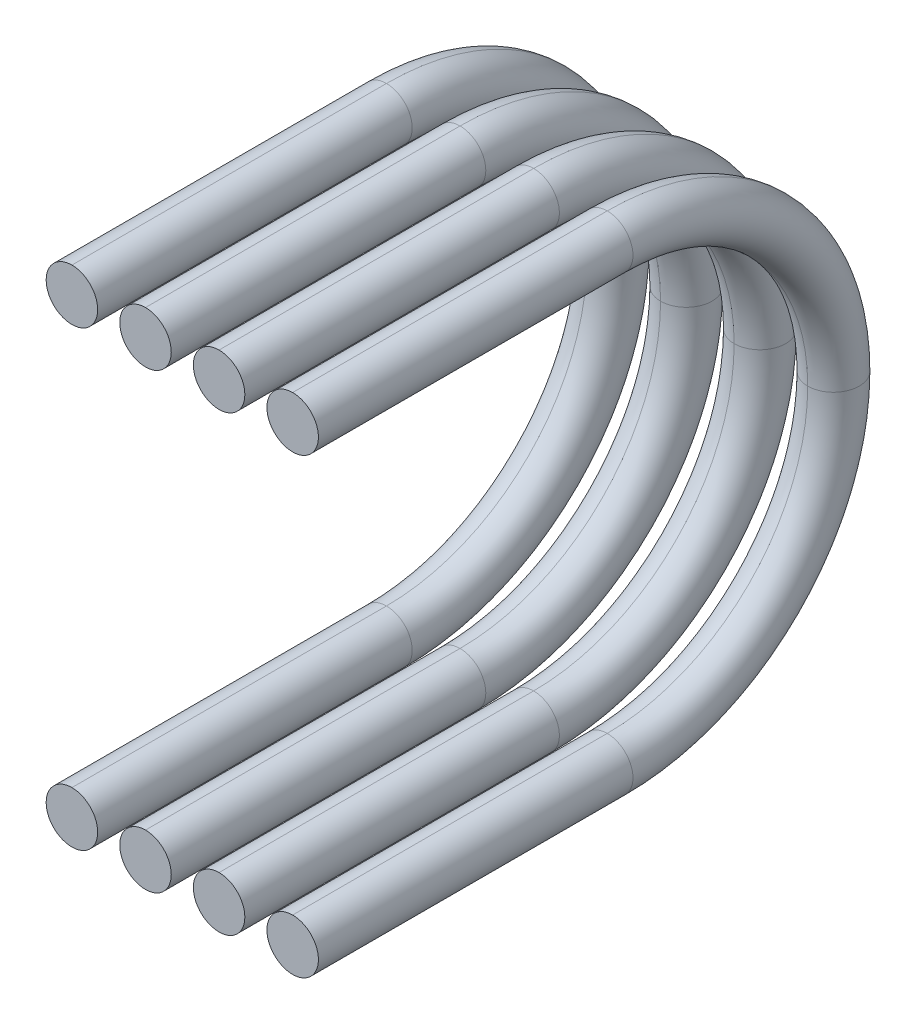
ISO-10303-21;
HEADER;
FILE_DESCRIPTION(('STEP AP214'),'2;1');
FILE_NAME('part.step','',(''),(''),'','','');
FILE_SCHEMA(('AUTOMOTIVE_DESIGN { 1 0 10303 214 1 1 1 1 }'));
ENDSEC;
DATA;
#1=APPLICATION_CONTEXT('core data for automotive mechanical design processes');
#2=APPLICATION_PROTOCOL_DEFINITION('international standard','automotive_design',2000,#1);
#3=PRODUCT_CONTEXT('',#1,'mechanical');
#4=PRODUCT('Part','Part','',(#3));
#5=PRODUCT_RELATED_PRODUCT_CATEGORY('part','',(#4));
#6=PRODUCT_DEFINITION_FORMATION('','',#4);
#7=PRODUCT_DEFINITION_CONTEXT('part definition',#1,'design');
#8=PRODUCT_DEFINITION('design','',#6,#7);
#9=PRODUCT_DEFINITION_SHAPE('','',#8);
#10=(LENGTH_UNIT() NAMED_UNIT(*) SI_UNIT(.MILLI.,.METRE.));
#11=(NAMED_UNIT(*) PLANE_ANGLE_UNIT() SI_UNIT($,.RADIAN.));
#12=(NAMED_UNIT(*) SI_UNIT($,.STERADIAN.) SOLID_ANGLE_UNIT());
#13=UNCERTAINTY_MEASURE_WITH_UNIT(LENGTH_MEASURE(1.E-05),#10,'distance_accuracy_value','');
#14=(GEOMETRIC_REPRESENTATION_CONTEXT(3) GLOBAL_UNCERTAINTY_ASSIGNED_CONTEXT((#13)) GLOBAL_UNIT_ASSIGNED_CONTEXT((#10,
#11,#12)) REPRESENTATION_CONTEXT('',''));
#15=CARTESIAN_POINT('',(0.,0.,0.));
#16=DIRECTION('',(0.,0.,1.));
#17=DIRECTION('',(1.,0.,0.));
#18=AXIS2_PLACEMENT_3D('',#15,#16,#17);
#19=CARTESIAN_POINT('',(0.,0.,0.));
#20=DIRECTION('',(0.,0.,1.));
#21=DIRECTION('',(1.,0.,0.));
#22=AXIS2_PLACEMENT_3D('',#19,#20,#21);
#23=PLANE('',#22);
#24=CARTESIAN_POINT('',(0.,0.,0.));
#25=DIRECTION('',(0.,0.,1.));
#26=DIRECTION('',(1.,0.,0.));
#27=AXIS2_PLACEMENT_3D('',#24,#25,#26);
#28=CIRCLE('',#27,0.7);
#29=CARTESIAN_POINT('',(0.,0.7,0.));
#30=VERTEX_POINT('',#29);
#31=CARTESIAN_POINT('',(0.,-0.7,0.));
#32=VERTEX_POINT('',#31);
#33=EDGE_CURVE('P0_E11',#30,#32,#28,.T.);
#34=ORIENTED_EDGE('',*,*,#33,.T.);
#35=CARTESIAN_POINT('',(0.,0.,0.));
#36=DIRECTION('',(0.,0.,1.));
#37=DIRECTION('',(1.,0.,0.));
#38=AXIS2_PLACEMENT_3D('',#35,#36,#37);
#39=CIRCLE('',#38,0.7);
#40=EDGE_CURVE('P0_E92',#32,#30,#39,.T.);
#41=ORIENTED_EDGE('',*,*,#40,.T.);
#42=EDGE_LOOP('',(#34,#41));
#43=FACE_BOUND('',#42,.T.);
#44=ADVANCED_FACE('P0_F17',(#43),#23,.T.);
#45=CARTESIAN_POINT('',(0.,12.3,0.));
#46=DIRECTION('',(0.,0.,-1.));
#47=DIRECTION('',(-1.,0.,0.));
#48=AXIS2_PLACEMENT_3D('',#45,#46,#47);
#49=PLANE('',#48);
#50=CARTESIAN_POINT('',(0.,12.3,0.));
#51=DIRECTION('',(0.,0.,-1.));
#52=DIRECTION('',(1.,0.,0.));
#53=AXIS2_PLACEMENT_3D('',#50,#51,#52);
#54=CIRCLE('',#53,0.7);
#55=CARTESIAN_POINT('',(0.,11.6,0.));
#56=VERTEX_POINT('',#55);
#57=CARTESIAN_POINT('',(0.,13.,0.));
#58=VERTEX_POINT('',#57);
#59=EDGE_CURVE('P0_E28',#56,#58,#54,.T.);
#60=ORIENTED_EDGE('',*,*,#59,.F.);
#61=CARTESIAN_POINT('',(0.,12.3,0.));
#62=DIRECTION('',(0.,0.,-1.));
#63=DIRECTION('',(1.,0.,0.));
#64=AXIS2_PLACEMENT_3D('',#61,#62,#63);
#65=CIRCLE('',#64,0.7);
#66=EDGE_CURVE('P0_E136',#58,#56,#65,.T.);
#67=ORIENTED_EDGE('',*,*,#66,.F.);
#68=EDGE_LOOP('',(#60,#67));
#69=FACE_BOUND('',#68,.T.);
#70=ADVANCED_FACE('P0_F242',(#69),#49,.F.);
#71=CARTESIAN_POINT('',(0.,0.,0.));
#72=DIRECTION('',(0.,0.,-1.));
#73=DIRECTION('',(0.,1.,0.));
#74=AXIS2_PLACEMENT_3D('',#71,#72,#73);
#75=CYLINDRICAL_SURFACE('',#74,0.7);
#76=DIRECTION('',(0.,0.,-1.));
#77=VECTOR('',#76,1.);
#78=CARTESIAN_POINT('',(0.,-0.7,0.));
#79=LINE('',#78,#77);
#80=CARTESIAN_POINT('',(0.,-0.7,-8.55));
#81=VERTEX_POINT('',#80);
#82=EDGE_CURVE('P0_E129',#32,#81,#79,.T.);
#83=ORIENTED_EDGE('',*,*,#82,.F.);
#84=ORIENTED_EDGE('',*,*,#33,.F.);
#85=DIRECTION('',(0.,0.,-1.));
#86=VECTOR('',#85,1.);
#87=CARTESIAN_POINT('',(0.,0.7,0.));
#88=LINE('',#87,#86);
#89=CARTESIAN_POINT('',(0.,0.7,-8.55));
#90=VERTEX_POINT('',#89);
#91=EDGE_CURVE('P0_E125',#30,#90,#88,.T.);
#92=ORIENTED_EDGE('',*,*,#91,.T.);
#93=CARTESIAN_POINT('',(0.,0.,-8.55));
#94=DIRECTION('',(0.,0.,1.));
#95=DIRECTION('',(1.,0.,0.));
#96=AXIS2_PLACEMENT_3D('',#93,#94,#95);
#97=CIRCLE('',#96,0.7);
#98=EDGE_CURVE('P0_E93',#90,#81,#97,.T.);
#99=ORIENTED_EDGE('',*,*,#98,.T.);
#100=EDGE_LOOP('',(#83,#84,#92,#99));
#101=FACE_BOUND('',#100,.T.);
#102=ADVANCED_FACE('P0_F269',(#101),#75,.T.);
#103=CARTESIAN_POINT('',(0.,6.15,-8.55));
#104=DIRECTION('',(1.,0.,0.));
#105=DIRECTION('',(0.,0.,-1.));
#106=AXIS2_PLACEMENT_3D('',#103,#104,#105);
#107=TOROIDAL_SURFACE('',#106,6.15,0.7);
#108=CARTESIAN_POINT('',(0.,6.15,-8.55));
#109=DIRECTION('',(1.,0.,0.));
#110=DIRECTION('',(0.,0.,-1.));
#111=AXIS2_PLACEMENT_3D('',#108,#109,#110);
#112=CIRCLE('',#111,6.85);
#113=CARTESIAN_POINT('',(0.,6.15,-15.4));
#114=VERTEX_POINT('',#113);
#115=CARTESIAN_POINT('',(0.,13.,-8.55));
#116=VERTEX_POINT('',#115);
#117=EDGE_CURVE('P0_E86',#114,#116,#112,.T.);
#118=ORIENTED_EDGE('',*,*,#117,.F.);
#119=CARTESIAN_POINT('',(0.,6.15,-14.7));
#120=DIRECTION('',(0.,-1.,0.));
#121=DIRECTION('',(0.,0.,-1.));
#122=AXIS2_PLACEMENT_3D('',#119,#120,#121);
#123=CIRCLE('',#122,0.7);
#124=CARTESIAN_POINT('',(0.,6.15,-14.));
#125=VERTEX_POINT('',#124);
#126=EDGE_CURVE('P0_E79',#125,#114,#123,.T.);
#127=ORIENTED_EDGE('',*,*,#126,.F.);
#128=CARTESIAN_POINT('',(0.,6.15,-8.55));
#129=DIRECTION('',(1.,0.,0.));
#130=DIRECTION('',(0.,0.,-1.));
#131=AXIS2_PLACEMENT_3D('',#128,#129,#130);
#132=CIRCLE('',#131,5.45);
#133=CARTESIAN_POINT('',(0.,11.6,-8.55));
#134=VERTEX_POINT('',#133);
#135=EDGE_CURVE('P0_E83',#125,#134,#132,.T.);
#136=ORIENTED_EDGE('',*,*,#135,.T.);
#137=CARTESIAN_POINT('',(0.,12.3,-8.55));
#138=DIRECTION('',(0.,0.,-1.));
#139=DIRECTION('',(1.,0.,0.));
#140=AXIS2_PLACEMENT_3D('',#137,#138,#139);
#141=CIRCLE('',#140,0.7);
#142=EDGE_CURVE('P0_E73',#134,#116,#141,.T.);
#143=ORIENTED_EDGE('',*,*,#142,.T.);
#144=EDGE_LOOP('',(#118,#127,#136,#143));
#145=FACE_BOUND('',#144,.T.);
#146=ADVANCED_FACE('P0_F81',(#145),#107,.T.);
#147=CARTESIAN_POINT('',(0.,12.3,-8.55));
#148=DIRECTION('',(0.,0.,1.));
#149=DIRECTION('',(0.,-1.,0.));
#150=AXIS2_PLACEMENT_3D('',#147,#148,#149);
#151=CYLINDRICAL_SURFACE('',#150,0.7);
#152=DIRECTION('',(0.,0.,1.));
#153=VECTOR('',#152,1.);
#154=CARTESIAN_POINT('',(0.,13.,-8.55));
#155=LINE('',#154,#153);
#156=EDGE_CURVE('P0_E104',#116,#58,#155,.T.);
#157=ORIENTED_EDGE('',*,*,#156,.F.);
#158=ORIENTED_EDGE('',*,*,#142,.F.);
#159=DIRECTION('',(0.,0.,1.));
#160=VECTOR('',#159,1.);
#161=CARTESIAN_POINT('',(0.,11.6,-8.55));
#162=LINE('',#161,#160);
#163=EDGE_CURVE('P0_E21',#134,#56,#162,.T.);
#164=ORIENTED_EDGE('',*,*,#163,.T.);
#165=ORIENTED_EDGE('',*,*,#59,.T.);
#166=EDGE_LOOP('',(#157,#158,#164,#165));
#167=FACE_BOUND('',#166,.T.);
#168=ADVANCED_FACE('P0_F251',(#167),#151,.T.);
#169=CARTESIAN_POINT('',(0.,0.,0.));
#170=DIRECTION('',(0.,0.,-1.));
#171=DIRECTION('',(0.,1.,0.));
#172=AXIS2_PLACEMENT_3D('',#169,#170,#171);
#173=CYLINDRICAL_SURFACE('',#172,0.7);
#174=ORIENTED_EDGE('',*,*,#40,.F.);
#175=ORIENTED_EDGE('',*,*,#82,.T.);
#176=CARTESIAN_POINT('',(0.,0.,-8.55));
#177=DIRECTION('',(0.,0.,1.));
#178=DIRECTION('',(1.,0.,0.));
#179=AXIS2_PLACEMENT_3D('',#176,#177,#178);
#180=CIRCLE('',#179,0.7);
#181=EDGE_CURVE('P0_E113',#81,#90,#180,.T.);
#182=ORIENTED_EDGE('',*,*,#181,.T.);
#183=ORIENTED_EDGE('',*,*,#91,.F.);
#184=EDGE_LOOP('',(#174,#175,#182,#183));
#185=FACE_BOUND('',#184,.T.);
#186=ADVANCED_FACE('P0_F256',(#185),#173,.T.);
#187=CARTESIAN_POINT('',(0.,6.15,-8.55));
#188=DIRECTION('',(1.,0.,0.));
#189=DIRECTION('',(0.,0.,-1.));
#190=AXIS2_PLACEMENT_3D('',#187,#188,#189);
#191=TOROIDAL_SURFACE('',#190,6.15,0.7);
#192=CARTESIAN_POINT('',(0.,6.15,-8.55));
#193=DIRECTION('',(1.,0.,0.));
#194=DIRECTION('',(0.,0.,-1.));
#195=AXIS2_PLACEMENT_3D('',#192,#193,#194);
#196=CIRCLE('',#195,6.85);
#197=EDGE_CURVE('P0_E105',#81,#114,#196,.T.);
#198=ORIENTED_EDGE('',*,*,#197,.F.);
#199=ORIENTED_EDGE('',*,*,#98,.F.);
#200=CARTESIAN_POINT('',(0.,6.15,-8.55));
#201=DIRECTION('',(1.,0.,0.));
#202=DIRECTION('',(0.,0.,-1.));
#203=AXIS2_PLACEMENT_3D('',#200,#201,#202);
#204=CIRCLE('',#203,5.45);
#205=EDGE_CURVE('P0_E97',#90,#125,#204,.T.);
#206=ORIENTED_EDGE('',*,*,#205,.T.);
#207=ORIENTED_EDGE('',*,*,#126,.T.);
#208=EDGE_LOOP('',(#198,#199,#206,#207));
#209=FACE_BOUND('',#208,.T.);
#210=ADVANCED_FACE('P0_F19',(#209),#191,.T.);
#211=CARTESIAN_POINT('',(0.,12.3,-8.55));
#212=DIRECTION('',(0.,0.,1.));
#213=DIRECTION('',(0.,-1.,0.));
#214=AXIS2_PLACEMENT_3D('',#211,#212,#213);
#215=CYLINDRICAL_SURFACE('',#214,0.7);
#216=CARTESIAN_POINT('',(0.,12.3,-8.55));
#217=DIRECTION('',(0.,0.,-1.));
#218=DIRECTION('',(1.,0.,0.));
#219=AXIS2_PLACEMENT_3D('',#216,#217,#218);
#220=CIRCLE('',#219,0.7);
#221=EDGE_CURVE('P0_E111',#116,#134,#220,.T.);
#222=ORIENTED_EDGE('',*,*,#221,.F.);
#223=ORIENTED_EDGE('',*,*,#156,.T.);
#224=ORIENTED_EDGE('',*,*,#66,.T.);
#225=ORIENTED_EDGE('',*,*,#163,.F.);
#226=EDGE_LOOP('',(#222,#223,#224,#225));
#227=FACE_BOUND('',#226,.T.);
#228=ADVANCED_FACE('P0_F225',(#227),#215,.T.);
#229=CARTESIAN_POINT('',(0.,6.15,-8.55));
#230=DIRECTION('',(1.,0.,0.));
#231=DIRECTION('',(0.,0.,-1.));
#232=AXIS2_PLACEMENT_3D('',#229,#230,#231);
#233=TOROIDAL_SURFACE('',#232,6.15,0.7);
#234=ORIENTED_EDGE('',*,*,#181,.F.);
#235=ORIENTED_EDGE('',*,*,#197,.T.);
#236=CARTESIAN_POINT('',(0.,6.15,-14.7));
#237=DIRECTION('',(0.,-1.,0.));
#238=DIRECTION('',(0.,0.,-1.));
#239=AXIS2_PLACEMENT_3D('',#236,#237,#238);
#240=CIRCLE('',#239,0.7);
#241=EDGE_CURVE('P0_E109',#114,#125,#240,.T.);
#242=ORIENTED_EDGE('',*,*,#241,.T.);
#243=ORIENTED_EDGE('',*,*,#205,.F.);
#244=EDGE_LOOP('',(#234,#235,#242,#243));
#245=FACE_BOUND('',#244,.T.);
#246=ADVANCED_FACE('P0_F115',(#245),#233,.T.);
#247=CARTESIAN_POINT('',(0.,6.15,-8.55));
#248=DIRECTION('',(1.,0.,0.));
#249=DIRECTION('',(0.,0.,-1.));
#250=AXIS2_PLACEMENT_3D('',#247,#248,#249);
#251=TOROIDAL_SURFACE('',#250,6.15,0.7);
#252=ORIENTED_EDGE('',*,*,#241,.F.);
#253=ORIENTED_EDGE('',*,*,#117,.T.);
#254=ORIENTED_EDGE('',*,*,#221,.T.);
#255=ORIENTED_EDGE('',*,*,#135,.F.);
#256=EDGE_LOOP('',(#252,#253,#254,#255));
#257=FACE_BOUND('',#256,.T.);
#258=ADVANCED_FACE('P0_F108',(#257),#251,.T.);
#259=CLOSED_SHELL('',(#44,#70,#102,#146,#168,#186,#210,#228,#246,#258));
#260=MANIFOLD_SOLID_BREP('P0_B1',#259);
#261=CARTESIAN_POINT('',(2.,0.,0.));
#262=DIRECTION('',(0.,0.,1.));
#263=DIRECTION('',(1.,0.,0.));
#264=AXIS2_PLACEMENT_3D('',#261,#262,#263);
#265=PLANE('',#264);
#266=CARTESIAN_POINT('',(2.,0.,0.));
#267=DIRECTION('',(0.,0.,1.));
#268=DIRECTION('',(1.,0.,0.));
#269=AXIS2_PLACEMENT_3D('',#266,#267,#268);
#270=CIRCLE('',#269,0.7);
#271=CARTESIAN_POINT('',(2.,0.7,0.));
#272=VERTEX_POINT('',#271);
#273=CARTESIAN_POINT('',(2.,-0.7,0.));
#274=VERTEX_POINT('',#273);
#275=EDGE_CURVE('P1_E11',#272,#274,#270,.T.);
#276=ORIENTED_EDGE('',*,*,#275,.T.);
#277=CARTESIAN_POINT('',(2.,0.,0.));
#278=DIRECTION('',(0.,0.,1.));
#279=DIRECTION('',(1.,0.,0.));
#280=AXIS2_PLACEMENT_3D('',#277,#278,#279);
#281=CIRCLE('',#280,0.7);
#282=EDGE_CURVE('P1_E135',#274,#272,#281,.T.);
#283=ORIENTED_EDGE('',*,*,#282,.T.);
#284=EDGE_LOOP('',(#276,#283));
#285=FACE_BOUND('',#284,.T.);
#286=ADVANCED_FACE('P1_F17',(#285),#265,.T.);
#287=CARTESIAN_POINT('',(2.,12.3,0.));
#288=DIRECTION('',(0.,0.,-1.));
#289=DIRECTION('',(-1.,0.,0.));
#290=AXIS2_PLACEMENT_3D('',#287,#288,#289);
#291=PLANE('',#290);
#292=CARTESIAN_POINT('',(2.,12.3,0.));
#293=DIRECTION('',(0.,0.,-1.));
#294=DIRECTION('',(1.,0.,0.));
#295=AXIS2_PLACEMENT_3D('',#292,#293,#294);
#296=CIRCLE('',#295,0.7);
#297=CARTESIAN_POINT('',(2.,11.6,0.));
#298=VERTEX_POINT('',#297);
#299=CARTESIAN_POINT('',(2.,13.,0.));
#300=VERTEX_POINT('',#299);
#301=EDGE_CURVE('P1_E28',#298,#300,#296,.T.);
#302=ORIENTED_EDGE('',*,*,#301,.F.);
#303=CARTESIAN_POINT('',(2.,12.3,0.));
#304=DIRECTION('',(0.,0.,-1.));
#305=DIRECTION('',(1.,0.,0.));
#306=AXIS2_PLACEMENT_3D('',#303,#304,#305);
#307=CIRCLE('',#306,0.7);
#308=EDGE_CURVE('P1_E103',#300,#298,#307,.T.);
#309=ORIENTED_EDGE('',*,*,#308,.F.);
#310=EDGE_LOOP('',(#302,#309));
#311=FACE_BOUND('',#310,.T.);
#312=ADVANCED_FACE('P1_F168',(#311),#291,.F.);
#313=CARTESIAN_POINT('',(2.,0.,0.));
#314=DIRECTION('',(0.,0.,-1.));
#315=DIRECTION('',(0.,1.,0.));
#316=AXIS2_PLACEMENT_3D('',#313,#314,#315);
#317=CYLINDRICAL_SURFACE('',#316,0.7);
#318=DIRECTION('',(0.,0.,-1.));
#319=VECTOR('',#318,1.);
#320=CARTESIAN_POINT('',(2.,-0.7,0.));
#321=LINE('',#320,#319);
#322=CARTESIAN_POINT('',(2.,-0.7,-8.55));
#323=VERTEX_POINT('',#322);
#324=EDGE_CURVE('P1_E138',#274,#323,#321,.T.);
#325=ORIENTED_EDGE('',*,*,#324,.F.);
#326=ORIENTED_EDGE('',*,*,#275,.F.);
#327=DIRECTION('',(0.,0.,-1.));
#328=VECTOR('',#327,1.);
#329=CARTESIAN_POINT('',(2.,0.7,0.));
#330=LINE('',#329,#328);
#331=CARTESIAN_POINT('',(2.,0.7,-8.55));
#332=VERTEX_POINT('',#331);
#333=EDGE_CURVE('P1_E93',#272,#332,#330,.T.);
#334=ORIENTED_EDGE('',*,*,#333,.T.);
#335=CARTESIAN_POINT('',(2.,0.,-8.55));
#336=DIRECTION('',(0.,0.,1.));
#337=DIRECTION('',(1.,0.,0.));
#338=AXIS2_PLACEMENT_3D('',#335,#336,#337);
#339=CIRCLE('',#338,0.7);
#340=EDGE_CURVE('P1_E141',#332,#323,#339,.T.);
#341=ORIENTED_EDGE('',*,*,#340,.T.);
#342=EDGE_LOOP('',(#325,#326,#334,#341));
#343=FACE_BOUND('',#342,.T.);
#344=ADVANCED_FACE('P1_F19',(#343),#317,.T.);
#345=CARTESIAN_POINT('',(2.,6.15,-8.55));
#346=DIRECTION('',(1.,0.,0.));
#347=DIRECTION('',(0.,0.,-1.));
#348=AXIS2_PLACEMENT_3D('',#345,#346,#347);
#349=TOROIDAL_SURFACE('',#348,6.15,0.7);
#350=CARTESIAN_POINT('',(2.,6.15,-8.55));
#351=DIRECTION('',(1.,0.,0.));
#352=DIRECTION('',(0.,0.,-1.));
#353=AXIS2_PLACEMENT_3D('',#350,#351,#352);
#354=CIRCLE('',#353,6.85);
#355=CARTESIAN_POINT('',(2.,6.15,-15.4));
#356=VERTEX_POINT('',#355);
#357=CARTESIAN_POINT('',(2.,13.,-8.55));
#358=VERTEX_POINT('',#357);
#359=EDGE_CURVE('P1_E87',#356,#358,#354,.T.);
#360=ORIENTED_EDGE('',*,*,#359,.F.);
#361=CARTESIAN_POINT('',(2.,6.15,-14.7));
#362=DIRECTION('',(0.,-1.,0.));
#363=DIRECTION('',(0.,0.,-1.));
#364=AXIS2_PLACEMENT_3D('',#361,#362,#363);
#365=CIRCLE('',#364,0.7);
#366=CARTESIAN_POINT('',(2.,6.15,-14.));
#367=VERTEX_POINT('',#366);
#368=EDGE_CURVE('P1_E139',#367,#356,#365,.T.);
#369=ORIENTED_EDGE('',*,*,#368,.F.);
#370=CARTESIAN_POINT('',(2.,6.15,-8.55));
#371=DIRECTION('',(1.,0.,0.));
#372=DIRECTION('',(0.,0.,-1.));
#373=AXIS2_PLACEMENT_3D('',#370,#371,#372);
#374=CIRCLE('',#373,5.45);
#375=CARTESIAN_POINT('',(2.,11.6,-8.55));
#376=VERTEX_POINT('',#375);
#377=EDGE_CURVE('P1_E90',#367,#376,#374,.T.);
#378=ORIENTED_EDGE('',*,*,#377,.T.);
#379=CARTESIAN_POINT('',(2.,12.3,-8.55));
#380=DIRECTION('',(0.,0.,-1.));
#381=DIRECTION('',(1.,0.,0.));
#382=AXIS2_PLACEMENT_3D('',#379,#380,#381);
#383=CIRCLE('',#382,0.7);
#384=EDGE_CURVE('P1_E77',#376,#358,#383,.T.);
#385=ORIENTED_EDGE('',*,*,#384,.T.);
#386=EDGE_LOOP('',(#360,#369,#378,#385));
#387=FACE_BOUND('',#386,.T.);
#388=ADVANCED_FACE('P1_F85',(#387),#349,.T.);
#389=CARTESIAN_POINT('',(2.,12.3,-8.55));
#390=DIRECTION('',(0.,0.,1.));
#391=DIRECTION('',(0.,-1.,0.));
#392=AXIS2_PLACEMENT_3D('',#389,#390,#391);
#393=CYLINDRICAL_SURFACE('',#392,0.7);
#394=DIRECTION('',(0.,0.,1.));
#395=VECTOR('',#394,1.);
#396=CARTESIAN_POINT('',(2.,13.,-8.55));
#397=LINE('',#396,#395);
#398=EDGE_CURVE('P1_E96',#358,#300,#397,.T.);
#399=ORIENTED_EDGE('',*,*,#398,.F.);
#400=ORIENTED_EDGE('',*,*,#384,.F.);
#401=DIRECTION('',(0.,0.,1.));
#402=VECTOR('',#401,1.);
#403=CARTESIAN_POINT('',(2.,11.6,-8.55));
#404=LINE('',#403,#402);
#405=EDGE_CURVE('P1_E21',#376,#298,#404,.T.);
#406=ORIENTED_EDGE('',*,*,#405,.T.);
#407=ORIENTED_EDGE('',*,*,#301,.T.);
#408=EDGE_LOOP('',(#399,#400,#406,#407));
#409=FACE_BOUND('',#408,.T.);
#410=ADVANCED_FACE('P1_F98',(#409),#393,.T.);
#411=CARTESIAN_POINT('',(2.,0.,0.));
#412=DIRECTION('',(0.,0.,-1.));
#413=DIRECTION('',(0.,1.,0.));
#414=AXIS2_PLACEMENT_3D('',#411,#412,#413);
#415=CYLINDRICAL_SURFACE('',#414,0.7);
#416=ORIENTED_EDGE('',*,*,#282,.F.);
#417=ORIENTED_EDGE('',*,*,#324,.T.);
#418=CARTESIAN_POINT('',(2.,0.,-8.55));
#419=DIRECTION('',(0.,0.,1.));
#420=DIRECTION('',(1.,0.,0.));
#421=AXIS2_PLACEMENT_3D('',#418,#419,#420);
#422=CIRCLE('',#421,0.7);
#423=EDGE_CURVE('P1_E125',#323,#332,#422,.T.);
#424=ORIENTED_EDGE('',*,*,#423,.T.);
#425=ORIENTED_EDGE('',*,*,#333,.F.);
#426=EDGE_LOOP('',(#416,#417,#424,#425));
#427=FACE_BOUND('',#426,.T.);
#428=ADVANCED_FACE('P1_F165',(#427),#415,.T.);
#429=CARTESIAN_POINT('',(2.,6.15,-8.55));
#430=DIRECTION('',(1.,0.,0.));
#431=DIRECTION('',(0.,0.,-1.));
#432=AXIS2_PLACEMENT_3D('',#429,#430,#431);
#433=TOROIDAL_SURFACE('',#432,6.15,0.7);
#434=CARTESIAN_POINT('',(2.,6.15,-8.55));
#435=DIRECTION('',(1.,0.,0.));
#436=DIRECTION('',(0.,0.,-1.));
#437=AXIS2_PLACEMENT_3D('',#434,#435,#436);
#438=CIRCLE('',#437,6.85);
#439=EDGE_CURVE('P1_E128',#323,#356,#438,.T.);
#440=ORIENTED_EDGE('',*,*,#439,.F.);
#441=ORIENTED_EDGE('',*,*,#340,.F.);
#442=CARTESIAN_POINT('',(2.,6.15,-8.55));
#443=DIRECTION('',(1.,0.,0.));
#444=DIRECTION('',(0.,0.,-1.));
#445=AXIS2_PLACEMENT_3D('',#442,#443,#444);
#446=CIRCLE('',#445,5.45);
#447=EDGE_CURVE('P1_E104',#332,#367,#446,.T.);
#448=ORIENTED_EDGE('',*,*,#447,.T.);
#449=ORIENTED_EDGE('',*,*,#368,.T.);
#450=EDGE_LOOP('',(#440,#441,#448,#449));
#451=FACE_BOUND('',#450,.T.);
#452=ADVANCED_FACE('P1_F161',(#451),#433,.T.);
#453=CARTESIAN_POINT('',(2.,12.3,-8.55));
#454=DIRECTION('',(0.,0.,1.));
#455=DIRECTION('',(0.,-1.,0.));
#456=AXIS2_PLACEMENT_3D('',#453,#454,#455);
#457=CYLINDRICAL_SURFACE('',#456,0.7);
#458=CARTESIAN_POINT('',(2.,12.3,-8.55));
#459=DIRECTION('',(0.,0.,-1.));
#460=DIRECTION('',(1.,0.,0.));
#461=AXIS2_PLACEMENT_3D('',#458,#459,#460);
#462=CIRCLE('',#461,0.7);
#463=EDGE_CURVE('P1_E106',#358,#376,#462,.T.);
#464=ORIENTED_EDGE('',*,*,#463,.F.);
#465=ORIENTED_EDGE('',*,*,#398,.T.);
#466=ORIENTED_EDGE('',*,*,#308,.T.);
#467=ORIENTED_EDGE('',*,*,#405,.F.);
#468=EDGE_LOOP('',(#464,#465,#466,#467));
#469=FACE_BOUND('',#468,.T.);
#470=ADVANCED_FACE('P1_F107',(#469),#457,.T.);
#471=CARTESIAN_POINT('',(2.,6.15,-8.55));
#472=DIRECTION('',(1.,0.,0.));
#473=DIRECTION('',(0.,0.,-1.));
#474=AXIS2_PLACEMENT_3D('',#471,#472,#473);
#475=TOROIDAL_SURFACE('',#474,6.15,0.7);
#476=ORIENTED_EDGE('',*,*,#423,.F.);
#477=ORIENTED_EDGE('',*,*,#439,.T.);
#478=CARTESIAN_POINT('',(2.,6.15,-14.7));
#479=DIRECTION('',(0.,-1.,0.));
#480=DIRECTION('',(0.,0.,-1.));
#481=AXIS2_PLACEMENT_3D('',#478,#479,#480);
#482=CIRCLE('',#481,0.7);
#483=EDGE_CURVE('P1_E113',#356,#367,#482,.T.);
#484=ORIENTED_EDGE('',*,*,#483,.T.);
#485=ORIENTED_EDGE('',*,*,#447,.F.);
#486=EDGE_LOOP('',(#476,#477,#484,#485));
#487=FACE_BOUND('',#486,.T.);
#488=ADVANCED_FACE('P1_F164',(#487),#475,.T.);
#489=CARTESIAN_POINT('',(2.,6.15,-8.55));
#490=DIRECTION('',(1.,0.,0.));
#491=DIRECTION('',(0.,0.,-1.));
#492=AXIS2_PLACEMENT_3D('',#489,#490,#491);
#493=TOROIDAL_SURFACE('',#492,6.15,0.7);
#494=ORIENTED_EDGE('',*,*,#483,.F.);
#495=ORIENTED_EDGE('',*,*,#359,.T.);
#496=ORIENTED_EDGE('',*,*,#463,.T.);
#497=ORIENTED_EDGE('',*,*,#377,.F.);
#498=EDGE_LOOP('',(#494,#495,#496,#497));
#499=FACE_BOUND('',#498,.T.);
#500=ADVANCED_FACE('P1_F111',(#499),#493,.T.);
#501=CLOSED_SHELL('',(#286,#312,#344,#388,#410,#428,#452,#470,#488,#500));
#502=MANIFOLD_SOLID_BREP('P1_B1',#501);
#503=CARTESIAN_POINT('',(4.,0.,0.));
#504=DIRECTION('',(0.,0.,1.));
#505=DIRECTION('',(1.,0.,0.));
#506=AXIS2_PLACEMENT_3D('',#503,#504,#505);
#507=PLANE('',#506);
#508=CARTESIAN_POINT('',(4.,0.,0.));
#509=DIRECTION('',(0.,0.,1.));
#510=DIRECTION('',(1.,0.,0.));
#511=AXIS2_PLACEMENT_3D('',#508,#509,#510);
#512=CIRCLE('',#511,0.7);
#513=CARTESIAN_POINT('',(4.,0.7,0.));
#514=VERTEX_POINT('',#513);
#515=CARTESIAN_POINT('',(4.,-0.7,0.));
#516=VERTEX_POINT('',#515);
#517=EDGE_CURVE('P2_E11',#514,#516,#512,.T.);
#518=ORIENTED_EDGE('',*,*,#517,.T.);
#519=CARTESIAN_POINT('',(4.,0.,0.));
#520=DIRECTION('',(0.,0.,1.));
#521=DIRECTION('',(1.,0.,0.));
#522=AXIS2_PLACEMENT_3D('',#519,#520,#521);
#523=CIRCLE('',#522,0.7);
#524=EDGE_CURVE('P2_E116',#516,#514,#523,.T.);
#525=ORIENTED_EDGE('',*,*,#524,.T.);
#526=EDGE_LOOP('',(#518,#525));
#527=FACE_BOUND('',#526,.T.);
#528=ADVANCED_FACE('P2_F17',(#527),#507,.T.);
#529=CARTESIAN_POINT('',(4.,12.3,0.));
#530=DIRECTION('',(0.,0.,-1.));
#531=DIRECTION('',(-1.,0.,0.));
#532=AXIS2_PLACEMENT_3D('',#529,#530,#531);
#533=PLANE('',#532);
#534=CARTESIAN_POINT('',(4.,12.3,0.));
#535=DIRECTION('',(0.,0.,-1.));
#536=DIRECTION('',(1.,0.,0.));
#537=AXIS2_PLACEMENT_3D('',#534,#535,#536);
#538=CIRCLE('',#537,0.7);
#539=CARTESIAN_POINT('',(4.,11.6,0.));
#540=VERTEX_POINT('',#539);
#541=CARTESIAN_POINT('',(4.,13.,0.));
#542=VERTEX_POINT('',#541);
#543=EDGE_CURVE('P2_E28',#540,#542,#538,.T.);
#544=ORIENTED_EDGE('',*,*,#543,.F.);
#545=CARTESIAN_POINT('',(4.,12.3,0.));
#546=DIRECTION('',(0.,0.,-1.));
#547=DIRECTION('',(1.,0.,0.));
#548=AXIS2_PLACEMENT_3D('',#545,#546,#547);
#549=CIRCLE('',#548,0.7);
#550=EDGE_CURVE('P2_E88',#542,#540,#549,.T.);
#551=ORIENTED_EDGE('',*,*,#550,.F.);
#552=EDGE_LOOP('',(#544,#551));
#553=FACE_BOUND('',#552,.T.);
#554=ADVANCED_FACE('P2_F89',(#553),#533,.F.);
#555=CARTESIAN_POINT('',(4.,0.,0.));
#556=DIRECTION('',(0.,0.,-1.));
#557=DIRECTION('',(0.,1.,0.));
#558=AXIS2_PLACEMENT_3D('',#555,#556,#557);
#559=CYLINDRICAL_SURFACE('',#558,0.7);
#560=DIRECTION('',(0.,0.,-1.));
#561=VECTOR('',#560,1.);
#562=CARTESIAN_POINT('',(4.,-0.7,0.));
#563=LINE('',#562,#561);
#564=CARTESIAN_POINT('',(4.,-0.7,-8.55));
#565=VERTEX_POINT('',#564);
#566=EDGE_CURVE('P2_E120',#516,#565,#563,.T.);
#567=ORIENTED_EDGE('',*,*,#566,.F.);
#568=ORIENTED_EDGE('',*,*,#517,.F.);
#569=DIRECTION('',(0.,0.,-1.));
#570=VECTOR('',#569,1.);
#571=CARTESIAN_POINT('',(4.,0.7,0.));
#572=LINE('',#571,#570);
#573=CARTESIAN_POINT('',(4.,0.7,-8.55));
#574=VERTEX_POINT('',#573);
#575=EDGE_CURVE('P2_E132',#514,#574,#572,.T.);
#576=ORIENTED_EDGE('',*,*,#575,.T.);
#577=CARTESIAN_POINT('',(4.,0.,-8.55));
#578=DIRECTION('',(0.,0.,1.));
#579=DIRECTION('',(1.,0.,0.));
#580=AXIS2_PLACEMENT_3D('',#577,#578,#579);
#581=CIRCLE('',#580,0.7);
#582=EDGE_CURVE('P2_E111',#574,#565,#581,.T.);
#583=ORIENTED_EDGE('',*,*,#582,.T.);
#584=EDGE_LOOP('',(#567,#568,#576,#583));
#585=FACE_BOUND('',#584,.T.);
#586=ADVANCED_FACE('P2_F19',(#585),#559,.T.);
#587=CARTESIAN_POINT('',(4.,6.15,-8.55));
#588=DIRECTION('',(1.,0.,0.));
#589=DIRECTION('',(0.,0.,-1.));
#590=AXIS2_PLACEMENT_3D('',#587,#588,#589);
#591=TOROIDAL_SURFACE('',#590,6.15,0.7);
#592=CARTESIAN_POINT('',(4.,6.15,-8.55));
#593=DIRECTION('',(1.,0.,0.));
#594=DIRECTION('',(0.,0.,-1.));
#595=AXIS2_PLACEMENT_3D('',#592,#593,#594);
#596=CIRCLE('',#595,6.85);
#597=CARTESIAN_POINT('',(4.,6.15,-15.4));
#598=VERTEX_POINT('',#597);
#599=CARTESIAN_POINT('',(4.,13.,-8.55));
#600=VERTEX_POINT('',#599);
#601=EDGE_CURVE('P2_E122',#598,#600,#596,.T.);
#602=ORIENTED_EDGE('',*,*,#601,.F.);
#603=CARTESIAN_POINT('',(4.,6.15,-14.7));
#604=DIRECTION('',(0.,-1.,0.));
#605=DIRECTION('',(0.,0.,-1.));
#606=AXIS2_PLACEMENT_3D('',#603,#604,#605);
#607=CIRCLE('',#606,0.7);
#608=CARTESIAN_POINT('',(4.,6.15,-14.));
#609=VERTEX_POINT('',#608);
#610=EDGE_CURVE('P2_E115',#609,#598,#607,.T.);
#611=ORIENTED_EDGE('',*,*,#610,.F.);
#612=CARTESIAN_POINT('',(4.,6.15,-8.55));
#613=DIRECTION('',(1.,0.,0.));
#614=DIRECTION('',(0.,0.,-1.));
#615=AXIS2_PLACEMENT_3D('',#612,#613,#614);
#616=CIRCLE('',#615,5.45);
#617=CARTESIAN_POINT('',(4.,11.6,-8.55));
#618=VERTEX_POINT('',#617);
#619=EDGE_CURVE('P2_E21',#609,#618,#616,.T.);
#620=ORIENTED_EDGE('',*,*,#619,.T.);
#621=CARTESIAN_POINT('',(4.,12.3,-8.55));
#622=DIRECTION('',(0.,0.,-1.));
#623=DIRECTION('',(1.,0.,0.));
#624=AXIS2_PLACEMENT_3D('',#621,#622,#623);
#625=CIRCLE('',#624,0.7);
#626=EDGE_CURVE('P2_E86',#618,#600,#625,.T.);
#627=ORIENTED_EDGE('',*,*,#626,.T.);
#628=EDGE_LOOP('',(#602,#611,#620,#627));
#629=FACE_BOUND('',#628,.T.);
#630=ADVANCED_FACE('P2_F155',(#629),#591,.T.);
#631=CARTESIAN_POINT('',(4.,12.3,-8.55));
#632=DIRECTION('',(0.,0.,1.));
#633=DIRECTION('',(0.,-1.,0.));
#634=AXIS2_PLACEMENT_3D('',#631,#632,#633);
#635=CYLINDRICAL_SURFACE('',#634,0.7);
#636=DIRECTION('',(0.,0.,1.));
#637=VECTOR('',#636,1.);
#638=CARTESIAN_POINT('',(4.,13.,-8.55));
#639=LINE('',#638,#637);
#640=EDGE_CURVE('P2_E79',#600,#542,#639,.T.);
#641=ORIENTED_EDGE('',*,*,#640,.F.);
#642=ORIENTED_EDGE('',*,*,#626,.F.);
#643=DIRECTION('',(0.,0.,1.));
#644=VECTOR('',#643,1.);
#645=CARTESIAN_POINT('',(4.,11.6,-8.55));
#646=LINE('',#645,#644);
#647=EDGE_CURVE('P2_E82',#618,#540,#646,.T.);
#648=ORIENTED_EDGE('',*,*,#647,.T.);
#649=ORIENTED_EDGE('',*,*,#543,.T.);
#650=EDGE_LOOP('',(#641,#642,#648,#649));
#651=FACE_BOUND('',#650,.T.);
#652=ADVANCED_FACE('P2_F77',(#651),#635,.T.);
#653=CARTESIAN_POINT('',(4.,0.,0.));
#654=DIRECTION('',(0.,0.,-1.));
#655=DIRECTION('',(0.,1.,0.));
#656=AXIS2_PLACEMENT_3D('',#653,#654,#655);
#657=CYLINDRICAL_SURFACE('',#656,0.7);
#658=ORIENTED_EDGE('',*,*,#524,.F.);
#659=ORIENTED_EDGE('',*,*,#566,.T.);
#660=CARTESIAN_POINT('',(4.,0.,-8.55));
#661=DIRECTION('',(0.,0.,1.));
#662=DIRECTION('',(1.,0.,0.));
#663=AXIS2_PLACEMENT_3D('',#660,#661,#662);
#664=CIRCLE('',#663,0.7);
#665=EDGE_CURVE('P2_E135',#565,#574,#664,.T.);
#666=ORIENTED_EDGE('',*,*,#665,.T.);
#667=ORIENTED_EDGE('',*,*,#575,.F.);
#668=EDGE_LOOP('',(#658,#659,#666,#667));
#669=FACE_BOUND('',#668,.T.);
#670=ADVANCED_FACE('P2_F221',(#669),#657,.T.);
#671=CARTESIAN_POINT('',(4.,6.15,-8.55));
#672=DIRECTION('',(1.,0.,0.));
#673=DIRECTION('',(0.,0.,-1.));
#674=AXIS2_PLACEMENT_3D('',#671,#672,#673);
#675=TOROIDAL_SURFACE('',#674,6.15,0.7);
#676=CARTESIAN_POINT('',(4.,6.15,-8.55));
#677=DIRECTION('',(1.,0.,0.));
#678=DIRECTION('',(0.,0.,-1.));
#679=AXIS2_PLACEMENT_3D('',#676,#677,#678);
#680=CIRCLE('',#679,6.85);
#681=EDGE_CURVE('P2_E105',#565,#598,#680,.T.);
#682=ORIENTED_EDGE('',*,*,#681,.F.);
#683=ORIENTED_EDGE('',*,*,#582,.F.);
#684=CARTESIAN_POINT('',(4.,6.15,-8.55));
#685=DIRECTION('',(1.,0.,0.));
#686=DIRECTION('',(0.,0.,-1.));
#687=AXIS2_PLACEMENT_3D('',#684,#685,#686);
#688=CIRCLE('',#687,5.45);
#689=EDGE_CURVE('P2_E98',#574,#609,#688,.T.);
#690=ORIENTED_EDGE('',*,*,#689,.T.);
#691=ORIENTED_EDGE('',*,*,#610,.T.);
#692=EDGE_LOOP('',(#682,#683,#690,#691));
#693=FACE_BOUND('',#692,.T.);
#694=ADVANCED_FACE('P2_F225',(#693),#675,.T.);
#695=CARTESIAN_POINT('',(4.,12.3,-8.55));
#696=DIRECTION('',(0.,0.,1.));
#697=DIRECTION('',(0.,-1.,0.));
#698=AXIS2_PLACEMENT_3D('',#695,#696,#697);
#699=CYLINDRICAL_SURFACE('',#698,0.7);
#700=CARTESIAN_POINT('',(4.,12.3,-8.55));
#701=DIRECTION('',(0.,0.,-1.));
#702=DIRECTION('',(1.,0.,0.));
#703=AXIS2_PLACEMENT_3D('',#700,#701,#702);
#704=CIRCLE('',#703,0.7);
#705=EDGE_CURVE('P2_E95',#600,#618,#704,.T.);
#706=ORIENTED_EDGE('',*,*,#705,.F.);
#707=ORIENTED_EDGE('',*,*,#640,.T.);
#708=ORIENTED_EDGE('',*,*,#550,.T.);
#709=ORIENTED_EDGE('',*,*,#647,.F.);
#710=EDGE_LOOP('',(#706,#707,#708,#709));
#711=FACE_BOUND('',#710,.T.);
#712=ADVANCED_FACE('P2_F93',(#711),#699,.T.);
#713=CARTESIAN_POINT('',(4.,6.15,-8.55));
#714=DIRECTION('',(1.,0.,0.));
#715=DIRECTION('',(0.,0.,-1.));
#716=AXIS2_PLACEMENT_3D('',#713,#714,#715);
#717=TOROIDAL_SURFACE('',#716,6.15,0.7);
#718=ORIENTED_EDGE('',*,*,#665,.F.);
#719=ORIENTED_EDGE('',*,*,#681,.T.);
#720=CARTESIAN_POINT('',(4.,6.15,-14.7));
#721=DIRECTION('',(0.,-1.,0.));
#722=DIRECTION('',(0.,0.,-1.));
#723=AXIS2_PLACEMENT_3D('',#720,#721,#722);
#724=CIRCLE('',#723,0.7);
#725=EDGE_CURVE('P2_E126',#598,#609,#724,.T.);
#726=ORIENTED_EDGE('',*,*,#725,.T.);
#727=ORIENTED_EDGE('',*,*,#689,.F.);
#728=EDGE_LOOP('',(#718,#719,#726,#727));
#729=FACE_BOUND('',#728,.T.);
#730=ADVANCED_FACE('P2_F149',(#729),#717,.T.);
#731=CARTESIAN_POINT('',(4.,6.15,-8.55));
#732=DIRECTION('',(1.,0.,0.));
#733=DIRECTION('',(0.,0.,-1.));
#734=AXIS2_PLACEMENT_3D('',#731,#732,#733);
#735=TOROIDAL_SURFACE('',#734,6.15,0.7);
#736=ORIENTED_EDGE('',*,*,#725,.F.);
#737=ORIENTED_EDGE('',*,*,#601,.T.);
#738=ORIENTED_EDGE('',*,*,#705,.T.);
#739=ORIENTED_EDGE('',*,*,#619,.F.);
#740=EDGE_LOOP('',(#736,#737,#738,#739));
#741=FACE_BOUND('',#740,.T.);
#742=ADVANCED_FACE('P2_F159',(#741),#735,.T.);
#743=CLOSED_SHELL('',(#528,#554,#586,#630,#652,#670,#694,#712,#730,#742));
#744=MANIFOLD_SOLID_BREP('P2_B1',#743);
#745=CARTESIAN_POINT('',(6.,0.,0.));
#746=DIRECTION('',(0.,0.,1.));
#747=DIRECTION('',(1.,0.,0.));
#748=AXIS2_PLACEMENT_3D('',#745,#746,#747);
#749=PLANE('',#748);
#750=CARTESIAN_POINT('',(6.,0.,0.));
#751=DIRECTION('',(0.,0.,1.));
#752=DIRECTION('',(1.,0.,0.));
#753=AXIS2_PLACEMENT_3D('',#750,#751,#752);
#754=CIRCLE('',#753,0.7);
#755=CARTESIAN_POINT('',(6.,0.7,0.));
#756=VERTEX_POINT('',#755);
#757=CARTESIAN_POINT('',(6.,-0.7,0.));
#758=VERTEX_POINT('',#757);
#759=EDGE_CURVE('P3_E11',#756,#758,#754,.T.);
#760=ORIENTED_EDGE('',*,*,#759,.T.);
#761=CARTESIAN_POINT('',(6.,0.,0.));
#762=DIRECTION('',(0.,0.,1.));
#763=DIRECTION('',(1.,0.,0.));
#764=AXIS2_PLACEMENT_3D('',#761,#762,#763);
#765=CIRCLE('',#764,0.7);
#766=EDGE_CURVE('P3_E101',#758,#756,#765,.T.);
#767=ORIENTED_EDGE('',*,*,#766,.T.);
#768=EDGE_LOOP('',(#760,#767));
#769=FACE_BOUND('',#768,.T.);
#770=ADVANCED_FACE('P3_F17',(#769),#749,.T.);
#771=CARTESIAN_POINT('',(6.,12.3,0.));
#772=DIRECTION('',(0.,0.,-1.));
#773=DIRECTION('',(-1.,0.,0.));
#774=AXIS2_PLACEMENT_3D('',#771,#772,#773);
#775=PLANE('',#774);
#776=CARTESIAN_POINT('',(6.,12.3,0.));
#777=DIRECTION('',(0.,0.,-1.));
#778=DIRECTION('',(1.,0.,0.));
#779=AXIS2_PLACEMENT_3D('',#776,#777,#778);
#780=CIRCLE('',#779,0.7);
#781=CARTESIAN_POINT('',(6.,11.6,0.));
#782=VERTEX_POINT('',#781);
#783=CARTESIAN_POINT('',(6.,13.,0.));
#784=VERTEX_POINT('',#783);
#785=EDGE_CURVE('P3_E28',#782,#784,#780,.T.);
#786=ORIENTED_EDGE('',*,*,#785,.F.);
#787=CARTESIAN_POINT('',(6.,12.3,0.));
#788=DIRECTION('',(0.,0.,-1.));
#789=DIRECTION('',(1.,0.,0.));
#790=AXIS2_PLACEMENT_3D('',#787,#788,#789);
#791=CIRCLE('',#790,0.7);
#792=EDGE_CURVE('P3_E130',#784,#782,#791,.T.);
#793=ORIENTED_EDGE('',*,*,#792,.F.);
#794=EDGE_LOOP('',(#786,#793));
#795=FACE_BOUND('',#794,.T.);
#796=ADVANCED_FACE('P3_F164',(#795),#775,.F.);
#797=CARTESIAN_POINT('',(6.,0.,0.));
#798=DIRECTION('',(0.,0.,-1.));
#799=DIRECTION('',(0.,1.,0.));
#800=AXIS2_PLACEMENT_3D('',#797,#798,#799);
#801=CYLINDRICAL_SURFACE('',#800,0.7);
#802=DIRECTION('',(0.,0.,-1.));
#803=VECTOR('',#802,1.);
#804=CARTESIAN_POINT('',(6.,-0.7,0.));
#805=LINE('',#804,#803);
#806=CARTESIAN_POINT('',(6.,-0.7,-8.55));
#807=VERTEX_POINT('',#806);
#808=EDGE_CURVE('P3_E134',#758,#807,#805,.T.);
#809=ORIENTED_EDGE('',*,*,#808,.F.);
#810=ORIENTED_EDGE('',*,*,#759,.F.);
#811=DIRECTION('',(0.,0.,-1.));
#812=VECTOR('',#811,1.);
#813=CARTESIAN_POINT('',(6.,0.7,0.));
#814=LINE('',#813,#812);
#815=CARTESIAN_POINT('',(6.,0.7,-8.55));
#816=VERTEX_POINT('',#815);
#817=EDGE_CURVE('P3_E73',#756,#816,#814,.T.);
#818=ORIENTED_EDGE('',*,*,#817,.T.);
#819=CARTESIAN_POINT('',(6.,0.,-8.55));
#820=DIRECTION('',(0.,0.,1.));
#821=DIRECTION('',(1.,0.,0.));
#822=AXIS2_PLACEMENT_3D('',#819,#820,#821);
#823=CIRCLE('',#822,0.7);
#824=EDGE_CURVE('P3_E102',#816,#807,#823,.T.);
#825=ORIENTED_EDGE('',*,*,#824,.T.);
#826=EDGE_LOOP('',(#809,#810,#818,#825));
#827=FACE_BOUND('',#826,.T.);
#828=ADVANCED_FACE('P3_F162',(#827),#801,.T.);
#829=CARTESIAN_POINT('',(6.,6.15,-8.55));
#830=DIRECTION('',(1.,0.,0.));
#831=DIRECTION('',(0.,0.,-1.));
#832=AXIS2_PLACEMENT_3D('',#829,#830,#831);
#833=TOROIDAL_SURFACE('',#832,6.15,0.7);
#834=CARTESIAN_POINT('',(6.,6.15,-8.55));
#835=DIRECTION('',(1.,0.,0.));
#836=DIRECTION('',(0.,0.,-1.));
#837=AXIS2_PLACEMENT_3D('',#834,#835,#836);
#838=CIRCLE('',#837,6.85);
#839=CARTESIAN_POINT('',(6.,6.15,-15.4));
#840=VERTEX_POINT('',#839);
#841=CARTESIAN_POINT('',(6.,13.,-8.55));
#842=VERTEX_POINT('',#841);
#843=EDGE_CURVE('P3_E95',#840,#842,#838,.T.);
#844=ORIENTED_EDGE('',*,*,#843,.F.);
#845=CARTESIAN_POINT('',(6.,6.15,-14.7));
#846=DIRECTION('',(0.,-1.,0.));
#847=DIRECTION('',(0.,0.,-1.));
#848=AXIS2_PLACEMENT_3D('',#845,#846,#847);
#849=CIRCLE('',#848,0.7);
#850=CARTESIAN_POINT('',(6.,6.15,-14.));
#851=VERTEX_POINT('',#850);
#852=EDGE_CURVE('P3_E88',#851,#840,#849,.T.);
#853=ORIENTED_EDGE('',*,*,#852,.F.);
#854=CARTESIAN_POINT('',(6.,6.15,-8.55));
#855=DIRECTION('',(1.,0.,0.));
#856=DIRECTION('',(0.,0.,-1.));
#857=AXIS2_PLACEMENT_3D('',#854,#855,#856);
#858=CIRCLE('',#857,5.45);
#859=CARTESIAN_POINT('',(6.,11.6,-8.55));
#860=VERTEX_POINT('',#859);
#861=EDGE_CURVE('P3_E92',#851,#860,#858,.T.);
#862=ORIENTED_EDGE('',*,*,#861,.T.);
#863=CARTESIAN_POINT('',(6.,12.3,-8.55));
#864=DIRECTION('',(0.,0.,-1.));
#865=DIRECTION('',(1.,0.,0.));
#866=AXIS2_PLACEMENT_3D('',#863,#864,#865);
#867=CIRCLE('',#866,0.7);
#868=EDGE_CURVE('P3_E144',#860,#842,#867,.T.);
#869=ORIENTED_EDGE('',*,*,#868,.T.);
#870=EDGE_LOOP('',(#844,#853,#862,#869));
#871=FACE_BOUND('',#870,.T.);
#872=ADVANCED_FACE('P3_F90',(#871),#833,.T.);
#873=CARTESIAN_POINT('',(6.,12.3,-8.55));
#874=DIRECTION('',(0.,0.,1.));
#875=DIRECTION('',(0.,-1.,0.));
#876=AXIS2_PLACEMENT_3D('',#873,#874,#875);
#877=CYLINDRICAL_SURFACE('',#876,0.7);
#878=DIRECTION('',(0.,0.,1.));
#879=VECTOR('',#878,1.);
#880=CARTESIAN_POINT('',(6.,13.,-8.55));
#881=LINE('',#880,#879);
#882=EDGE_CURVE('P3_E111',#842,#784,#881,.T.);
#883=ORIENTED_EDGE('',*,*,#882,.F.);
#884=ORIENTED_EDGE('',*,*,#868,.F.);
#885=DIRECTION('',(0.,0.,1.));
#886=VECTOR('',#885,1.);
#887=CARTESIAN_POINT('',(6.,11.6,-8.55));
#888=LINE('',#887,#886);
#889=EDGE_CURVE('P3_E137',#860,#782,#888,.T.);
#890=ORIENTED_EDGE('',*,*,#889,.T.);
#891=ORIENTED_EDGE('',*,*,#785,.T.);
#892=EDGE_LOOP('',(#883,#884,#890,#891));
#893=FACE_BOUND('',#892,.T.);
#894=ADVANCED_FACE('P3_F19',(#893),#877,.T.);
#895=CARTESIAN_POINT('',(6.,0.,0.));
#896=DIRECTION('',(0.,0.,-1.));
#897=DIRECTION('',(0.,1.,0.));
#898=AXIS2_PLACEMENT_3D('',#895,#896,#897);
#899=CYLINDRICAL_SURFACE('',#898,0.7);
#900=ORIENTED_EDGE('',*,*,#766,.F.);
#901=ORIENTED_EDGE('',*,*,#808,.T.);
#902=CARTESIAN_POINT('',(6.,0.,-8.55));
#903=DIRECTION('',(0.,0.,1.));
#904=DIRECTION('',(1.,0.,0.));
#905=AXIS2_PLACEMENT_3D('',#902,#903,#904);
#906=CIRCLE('',#905,0.7);
#907=EDGE_CURVE('P3_E119',#807,#816,#906,.T.);
#908=ORIENTED_EDGE('',*,*,#907,.T.);
#909=ORIENTED_EDGE('',*,*,#817,.F.);
#910=EDGE_LOOP('',(#900,#901,#908,#909));
#911=FACE_BOUND('',#910,.T.);
#912=ADVANCED_FACE('P3_F161',(#911),#899,.T.);
#913=CARTESIAN_POINT('',(6.,6.15,-8.55));
#914=DIRECTION('',(1.,0.,0.));
#915=DIRECTION('',(0.,0.,-1.));
#916=AXIS2_PLACEMENT_3D('',#913,#914,#915);
#917=TOROIDAL_SURFACE('',#916,6.15,0.7);
#918=CARTESIAN_POINT('',(6.,6.15,-8.55));
#919=DIRECTION('',(1.,0.,0.));
#920=DIRECTION('',(0.,0.,-1.));
#921=AXIS2_PLACEMENT_3D('',#918,#919,#920);
#922=CIRCLE('',#921,6.85);
#923=EDGE_CURVE('P3_E112',#807,#840,#922,.T.);
#924=ORIENTED_EDGE('',*,*,#923,.F.);
#925=ORIENTED_EDGE('',*,*,#824,.F.);
#926=CARTESIAN_POINT('',(6.,6.15,-8.55));
#927=DIRECTION('',(1.,0.,0.));
#928=DIRECTION('',(0.,0.,-1.));
#929=AXIS2_PLACEMENT_3D('',#926,#927,#928);
#930=CIRCLE('',#929,5.45);
#931=EDGE_CURVE('P3_E21',#816,#851,#930,.T.);
#932=ORIENTED_EDGE('',*,*,#931,.T.);
#933=ORIENTED_EDGE('',*,*,#852,.T.);
#934=EDGE_LOOP('',(#924,#925,#932,#933));
#935=FACE_BOUND('',#934,.T.);
#936=ADVANCED_FACE('P3_F105',(#935),#917,.T.);
#937=CARTESIAN_POINT('',(6.,12.3,-8.55));
#938=DIRECTION('',(0.,0.,1.));
#939=DIRECTION('',(0.,-1.,0.));
#940=AXIS2_PLACEMENT_3D('',#937,#938,#939);
#941=CYLINDRICAL_SURFACE('',#940,0.7);
#942=CARTESIAN_POINT('',(6.,12.3,-8.55));
#943=DIRECTION('',(0.,0.,-1.));
#944=DIRECTION('',(1.,0.,0.));
#945=AXIS2_PLACEMENT_3D('',#942,#943,#944);
#946=CIRCLE('',#945,0.7);
#947=EDGE_CURVE('P3_E117',#842,#860,#946,.T.);
#948=ORIENTED_EDGE('',*,*,#947,.F.);
#949=ORIENTED_EDGE('',*,*,#882,.T.);
#950=ORIENTED_EDGE('',*,*,#792,.T.);
#951=ORIENTED_EDGE('',*,*,#889,.F.);
#952=EDGE_LOOP('',(#948,#949,#950,#951));
#953=FACE_BOUND('',#952,.T.);
#954=ADVANCED_FACE('P3_F181',(#953),#941,.T.);
#955=CARTESIAN_POINT('',(6.,6.15,-8.55));
#956=DIRECTION('',(1.,0.,0.));
#957=DIRECTION('',(0.,0.,-1.));
#958=AXIS2_PLACEMENT_3D('',#955,#956,#957);
#959=TOROIDAL_SURFACE('',#958,6.15,0.7);
#960=ORIENTED_EDGE('',*,*,#907,.F.);
#961=ORIENTED_EDGE('',*,*,#923,.T.);
#962=CARTESIAN_POINT('',(6.,6.15,-14.7));
#963=DIRECTION('',(0.,-1.,0.));
#964=DIRECTION('',(0.,0.,-1.));
#965=AXIS2_PLACEMENT_3D('',#962,#963,#964);
#966=CIRCLE('',#965,0.7);
#967=EDGE_CURVE('P3_E115',#840,#851,#966,.T.);
#968=ORIENTED_EDGE('',*,*,#967,.T.);
#969=ORIENTED_EDGE('',*,*,#931,.F.);
#970=EDGE_LOOP('',(#960,#961,#968,#969));
#971=FACE_BOUND('',#970,.T.);
#972=ADVANCED_FACE('P3_F121',(#971),#959,.T.);
#973=CARTESIAN_POINT('',(6.,6.15,-8.55));
#974=DIRECTION('',(1.,0.,0.));
#975=DIRECTION('',(0.,0.,-1.));
#976=AXIS2_PLACEMENT_3D('',#973,#974,#975);
#977=TOROIDAL_SURFACE('',#976,6.15,0.7);
#978=ORIENTED_EDGE('',*,*,#967,.F.);
#979=ORIENTED_EDGE('',*,*,#843,.T.);
#980=ORIENTED_EDGE('',*,*,#947,.T.);
#981=ORIENTED_EDGE('',*,*,#861,.F.);
#982=EDGE_LOOP('',(#978,#979,#980,#981));
#983=FACE_BOUND('',#982,.T.);
#984=ADVANCED_FACE('P3_F114',(#983),#977,.T.);
#985=CLOSED_SHELL('',(#770,#796,#828,#872,#894,#912,#936,#954,#972,#984));
#986=MANIFOLD_SOLID_BREP('P3_B1',#985);
#987=ADVANCED_BREP_SHAPE_REPRESENTATION('',(#18,#260,#502,#744,#986),#14);
#988=SHAPE_DEFINITION_REPRESENTATION(#9,#987);
ENDSEC;
END-ISO-10303-21;
